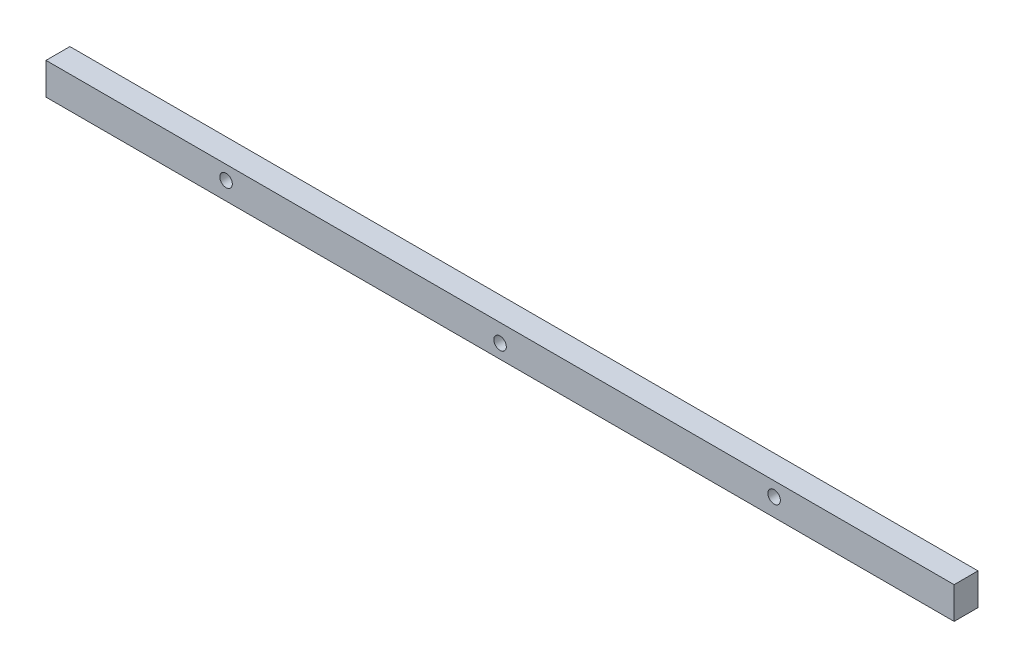
ISO-10303-21;
HEADER;
FILE_DESCRIPTION(('STEP AP214'),'2;1');
FILE_NAME('part.step','',(''),(''),'','','');
FILE_SCHEMA(('AUTOMOTIVE_DESIGN { 1 0 10303 214 1 1 1 1 }'));
ENDSEC;
DATA;
#1=APPLICATION_CONTEXT('core data for automotive mechanical design processes');
#2=APPLICATION_PROTOCOL_DEFINITION('international standard','automotive_design',2000,#1);
#3=PRODUCT_CONTEXT('',#1,'mechanical');
#4=PRODUCT('Part','Part','',(#3));
#5=PRODUCT_RELATED_PRODUCT_CATEGORY('part','',(#4));
#6=PRODUCT_DEFINITION_FORMATION('','',#4);
#7=PRODUCT_DEFINITION_CONTEXT('part definition',#1,'design');
#8=PRODUCT_DEFINITION('design','',#6,#7);
#9=PRODUCT_DEFINITION_SHAPE('','',#8);
#10=(LENGTH_UNIT() NAMED_UNIT(*) SI_UNIT(.MILLI.,.METRE.));
#11=(NAMED_UNIT(*) PLANE_ANGLE_UNIT() SI_UNIT($,.RADIAN.));
#12=(NAMED_UNIT(*) SI_UNIT($,.STERADIAN.) SOLID_ANGLE_UNIT());
#13=UNCERTAINTY_MEASURE_WITH_UNIT(LENGTH_MEASURE(1.E-05),#10,'distance_accuracy_value','');
#14=(GEOMETRIC_REPRESENTATION_CONTEXT(3) GLOBAL_UNCERTAINTY_ASSIGNED_CONTEXT((#13)) GLOBAL_UNIT_ASSIGNED_CONTEXT((#10,
#11,#12)) REPRESENTATION_CONTEXT('',''));
#15=CARTESIAN_POINT('',(0.,0.,0.));
#16=DIRECTION('',(0.,0.,1.));
#17=DIRECTION('',(1.,0.,0.));
#18=AXIS2_PLACEMENT_3D('',#15,#16,#17);
#19=CARTESIAN_POINT('',(0.,0.,9.525));
#20=DIRECTION('',(0.,0.,-1.));
#21=DIRECTION('',(-1.,0.,0.));
#22=AXIS2_PLACEMENT_3D('',#19,#20,#21);
#23=PLANE('',#22);
#24=DIRECTION('',(0.,-1.,0.));
#25=VECTOR('',#24,1.);
#26=CARTESIAN_POINT('',(0.,0.,9.525));
#27=LINE('',#26,#25);
#28=CARTESIAN_POINT('',(0.,12.7,9.525));
#29=VERTEX_POINT('',#28);
#30=CARTESIAN_POINT('',(0.,0.,9.525));
#31=VERTEX_POINT('',#30);
#32=EDGE_CURVE('E85',#29,#31,#27,.T.);
#33=ORIENTED_EDGE('',*,*,#32,.T.);
#34=DIRECTION('',(1.,0.,0.));
#35=VECTOR('',#34,1.);
#36=CARTESIAN_POINT('',(0.,0.,9.525));
#37=LINE('',#36,#35);
#38=CARTESIAN_POINT('',(361.95,0.,9.525));
#39=VERTEX_POINT('',#38);
#40=EDGE_CURVE('E80',#31,#39,#37,.T.);
#41=ORIENTED_EDGE('',*,*,#40,.T.);
#42=DIRECTION('',(0.,1.,0.));
#43=VECTOR('',#42,1.);
#44=CARTESIAN_POINT('',(361.95,0.,9.525));
#45=LINE('',#44,#43);
#46=CARTESIAN_POINT('',(361.95,12.7,9.525));
#47=VERTEX_POINT('',#46);
#48=EDGE_CURVE('E83',#39,#47,#45,.T.);
#49=ORIENTED_EDGE('',*,*,#48,.T.);
#50=DIRECTION('',(-1.,0.,0.));
#51=VECTOR('',#50,1.);
#52=CARTESIAN_POINT('',(0.,12.7,9.525));
#53=LINE('',#52,#51);
#54=EDGE_CURVE('E50',#47,#29,#53,.T.);
#55=ORIENTED_EDGE('',*,*,#54,.T.);
#56=EDGE_LOOP('',(#33,#41,#49,#55));
#57=FACE_BOUND('',#56,.T.);
#58=CARTESIAN_POINT('',(180.975,5.55625,9.525));
#59=DIRECTION('',(0.,0.,1.));
#60=DIRECTION('',(1.,0.,0.));
#61=AXIS2_PLACEMENT_3D('',#58,#59,#60);
#62=CIRCLE('',#61,2.5);
#63=CARTESIAN_POINT('',(178.475,5.55625,9.525));
#64=VERTEX_POINT('',#63);
#65=EDGE_CURVE('E100',#64,#64,#62,.T.);
#66=ORIENTED_EDGE('',*,*,#65,.F.);
#67=EDGE_LOOP('',(#66));
#68=FACE_BOUND('',#67,.T.);
#69=CARTESIAN_POINT('',(71.755,7.14375,9.525));
#70=DIRECTION('',(0.,0.,1.));
#71=DIRECTION('',(1.,0.,0.));
#72=AXIS2_PLACEMENT_3D('',#69,#70,#71);
#73=CIRCLE('',#72,2.49999999999999);
#74=CARTESIAN_POINT('',(69.255,7.14375,9.525));
#75=VERTEX_POINT('',#74);
#76=EDGE_CURVE('E115',#75,#75,#73,.T.);
#77=ORIENTED_EDGE('',*,*,#76,.F.);
#78=EDGE_LOOP('',(#77));
#79=FACE_BOUND('',#78,.T.);
#80=CARTESIAN_POINT('',(290.195,7.14375000000004,9.525));
#81=DIRECTION('',(0.,0.,1.));
#82=DIRECTION('',(1.,0.,0.));
#83=AXIS2_PLACEMENT_3D('',#80,#81,#82);
#84=CIRCLE('',#83,2.49999999999996);
#85=CARTESIAN_POINT('',(287.695,7.14375000000004,9.525));
#86=VERTEX_POINT('',#85);
#87=EDGE_CURVE('E121',#86,#86,#84,.T.);
#88=ORIENTED_EDGE('',*,*,#87,.F.);
#89=EDGE_LOOP('',(#88));
#90=FACE_BOUND('',#89,.T.);
#91=ADVANCED_FACE('F33',(#57,#68,#79,#90),#23,.F.);
#92=CARTESIAN_POINT('',(0.,0.,0.));
#93=DIRECTION('',(0.,0.,-1.));
#94=DIRECTION('',(-1.,0.,0.));
#95=AXIS2_PLACEMENT_3D('',#92,#93,#94);
#96=PLANE('',#95);
#97=CARTESIAN_POINT('',(71.755,7.14375,0.));
#98=DIRECTION('',(0.,0.,1.));
#99=DIRECTION('',(1.,0.,0.));
#100=AXIS2_PLACEMENT_3D('',#97,#98,#99);
#101=CIRCLE('',#100,2.49999999999999);
#102=CARTESIAN_POINT('',(69.255,7.14375,0.));
#103=VERTEX_POINT('',#102);
#104=EDGE_CURVE('E118',#103,#103,#101,.T.);
#105=ORIENTED_EDGE('',*,*,#104,.T.);
#106=EDGE_LOOP('',(#105));
#107=FACE_BOUND('',#106,.T.);
#108=DIRECTION('',(0.,-1.,0.));
#109=VECTOR('',#108,1.);
#110=CARTESIAN_POINT('',(0.,0.,0.));
#111=LINE('',#110,#109);
#112=CARTESIAN_POINT('',(0.,12.7,0.));
#113=VERTEX_POINT('',#112);
#114=CARTESIAN_POINT('',(0.,0.,0.));
#115=VERTEX_POINT('',#114);
#116=EDGE_CURVE('E97',#113,#115,#111,.T.);
#117=ORIENTED_EDGE('',*,*,#116,.F.);
#118=DIRECTION('',(-1.,0.,0.));
#119=VECTOR('',#118,1.);
#120=CARTESIAN_POINT('',(0.,12.7,0.));
#121=LINE('',#120,#119);
#122=CARTESIAN_POINT('',(361.95,12.7,0.));
#123=VERTEX_POINT('',#122);
#124=EDGE_CURVE('E73',#123,#113,#121,.T.);
#125=ORIENTED_EDGE('',*,*,#124,.F.);
#126=DIRECTION('',(0.,1.,0.));
#127=VECTOR('',#126,1.);
#128=CARTESIAN_POINT('',(361.95,0.,0.));
#129=LINE('',#128,#127);
#130=CARTESIAN_POINT('',(361.95,0.,0.));
#131=VERTEX_POINT('',#130);
#132=EDGE_CURVE('E67',#131,#123,#129,.T.);
#133=ORIENTED_EDGE('',*,*,#132,.F.);
#134=DIRECTION('',(1.,0.,0.));
#135=VECTOR('',#134,1.);
#136=CARTESIAN_POINT('',(0.,0.,0.));
#137=LINE('',#136,#135);
#138=EDGE_CURVE('E89',#115,#131,#137,.T.);
#139=ORIENTED_EDGE('',*,*,#138,.F.);
#140=EDGE_LOOP('',(#117,#125,#133,#139));
#141=FACE_BOUND('',#140,.T.);
#142=CARTESIAN_POINT('',(180.975,5.55625,0.));
#143=DIRECTION('',(0.,0.,1.));
#144=DIRECTION('',(1.,0.,0.));
#145=AXIS2_PLACEMENT_3D('',#142,#143,#144);
#146=CIRCLE('',#145,2.5);
#147=CARTESIAN_POINT('',(178.475,5.55625,0.));
#148=VERTEX_POINT('',#147);
#149=EDGE_CURVE('E112',#148,#148,#146,.T.);
#150=ORIENTED_EDGE('',*,*,#149,.T.);
#151=EDGE_LOOP('',(#150));
#152=FACE_BOUND('',#151,.T.);
#153=CARTESIAN_POINT('',(290.195,7.14375000000004,0.));
#154=DIRECTION('',(0.,0.,1.));
#155=DIRECTION('',(1.,0.,0.));
#156=AXIS2_PLACEMENT_3D('',#153,#154,#155);
#157=CIRCLE('',#156,2.49999999999996);
#158=CARTESIAN_POINT('',(287.695,7.14375000000004,0.));
#159=VERTEX_POINT('',#158);
#160=EDGE_CURVE('E124',#159,#159,#157,.T.);
#161=ORIENTED_EDGE('',*,*,#160,.T.);
#162=EDGE_LOOP('',(#161));
#163=FACE_BOUND('',#162,.T.);
#164=ADVANCED_FACE('F108',(#107,#141,#152,#163),#96,.T.);
#165=CARTESIAN_POINT('',(0.,0.,9.525));
#166=DIRECTION('',(1.,0.,0.));
#167=DIRECTION('',(0.,0.,-1.));
#168=AXIS2_PLACEMENT_3D('',#165,#166,#167);
#169=PLANE('',#168);
#170=ORIENTED_EDGE('',*,*,#116,.T.);
#171=DIRECTION('',(0.,0.,-1.));
#172=VECTOR('',#171,1.);
#173=CARTESIAN_POINT('',(0.,0.,9.525));
#174=LINE('',#173,#172);
#175=EDGE_CURVE('E11',#31,#115,#174,.T.);
#176=ORIENTED_EDGE('',*,*,#175,.F.);
#177=ORIENTED_EDGE('',*,*,#32,.F.);
#178=DIRECTION('',(0.,0.,-1.));
#179=VECTOR('',#178,1.);
#180=CARTESIAN_POINT('',(0.,12.7,9.525));
#181=LINE('',#180,#179);
#182=EDGE_CURVE('E93',#29,#113,#181,.T.);
#183=ORIENTED_EDGE('',*,*,#182,.T.);
#184=EDGE_LOOP('',(#170,#176,#177,#183));
#185=FACE_BOUND('',#184,.T.);
#186=ADVANCED_FACE('F35',(#185),#169,.F.);
#187=CARTESIAN_POINT('',(0.,0.,9.525));
#188=DIRECTION('',(0.,1.,0.));
#189=DIRECTION('',(0.,0.,1.));
#190=AXIS2_PLACEMENT_3D('',#187,#188,#189);
#191=PLANE('',#190);
#192=ORIENTED_EDGE('',*,*,#138,.T.);
#193=DIRECTION('',(0.,0.,-1.));
#194=VECTOR('',#193,1.);
#195=CARTESIAN_POINT('',(361.95,0.,9.525));
#196=LINE('',#195,#194);
#197=EDGE_CURVE('E42',#39,#131,#196,.T.);
#198=ORIENTED_EDGE('',*,*,#197,.F.);
#199=ORIENTED_EDGE('',*,*,#40,.F.);
#200=ORIENTED_EDGE('',*,*,#175,.T.);
#201=EDGE_LOOP('',(#192,#198,#199,#200));
#202=FACE_BOUND('',#201,.T.);
#203=ADVANCED_FACE('F88',(#202),#191,.F.);
#204=CARTESIAN_POINT('',(361.95,0.,9.525));
#205=DIRECTION('',(-1.,0.,0.));
#206=DIRECTION('',(0.,0.,1.));
#207=AXIS2_PLACEMENT_3D('',#204,#205,#206);
#208=PLANE('',#207);
#209=ORIENTED_EDGE('',*,*,#132,.T.);
#210=DIRECTION('',(0.,0.,-1.));
#211=VECTOR('',#210,1.);
#212=CARTESIAN_POINT('',(361.95,12.7,9.525));
#213=LINE('',#212,#211);
#214=EDGE_CURVE('E90',#47,#123,#213,.T.);
#215=ORIENTED_EDGE('',*,*,#214,.F.);
#216=ORIENTED_EDGE('',*,*,#48,.F.);
#217=ORIENTED_EDGE('',*,*,#197,.T.);
#218=EDGE_LOOP('',(#209,#215,#216,#217));
#219=FACE_BOUND('',#218,.T.);
#220=ADVANCED_FACE('F91',(#219),#208,.F.);
#221=CARTESIAN_POINT('',(0.,12.7,9.525));
#222=DIRECTION('',(0.,-1.,0.));
#223=DIRECTION('',(0.,0.,-1.));
#224=AXIS2_PLACEMENT_3D('',#221,#222,#223);
#225=PLANE('',#224);
#226=ORIENTED_EDGE('',*,*,#124,.T.);
#227=ORIENTED_EDGE('',*,*,#182,.F.);
#228=ORIENTED_EDGE('',*,*,#54,.F.);
#229=ORIENTED_EDGE('',*,*,#214,.T.);
#230=EDGE_LOOP('',(#226,#227,#228,#229));
#231=FACE_BOUND('',#230,.T.);
#232=ADVANCED_FACE('F105',(#231),#225,.F.);
#233=CARTESIAN_POINT('',(180.975,5.55625,9.525));
#234=DIRECTION('',(0.,0.,-1.));
#235=DIRECTION('',(-1.,0.,0.));
#236=AXIS2_PLACEMENT_3D('',#233,#234,#235);
#237=CYLINDRICAL_SURFACE('',#236,2.5);
#238=CARTESIAN_POINT('',(178.475,5.55625,9.525));
#239=CARTESIAN_POINT('',(178.475,5.55625,9.42578125));
#240=CARTESIAN_POINT('',(178.475,5.55625,9.3265625));
#241=CARTESIAN_POINT('',(178.475,5.55625,9.128125));
#242=CARTESIAN_POINT('',(178.475,5.55625,9.02890625));
#243=CARTESIAN_POINT('',(178.475,5.55625,8.83046875));
#244=CARTESIAN_POINT('',(178.475,5.55625,8.73125));
#245=CARTESIAN_POINT('',(178.475,5.55625,8.5328125));
#246=CARTESIAN_POINT('',(178.475,5.55625,8.43359375));
#247=CARTESIAN_POINT('',(178.475,5.55625,8.23515625));
#248=CARTESIAN_POINT('',(178.475,5.55625,8.1359375));
#249=CARTESIAN_POINT('',(178.475,5.55625,7.9375));
#250=CARTESIAN_POINT('',(178.475,5.55625,7.83828125));
#251=CARTESIAN_POINT('',(178.475,5.55625,7.63984375));
#252=CARTESIAN_POINT('',(178.475,5.55625,7.540625));
#253=CARTESIAN_POINT('',(178.475,5.55625,7.3421875));
#254=CARTESIAN_POINT('',(178.475,5.55625,7.24296875));
#255=CARTESIAN_POINT('',(178.475,5.55625,7.04453125));
#256=CARTESIAN_POINT('',(178.475,5.55625,6.9453125));
#257=CARTESIAN_POINT('',(178.475,5.55625,6.746875));
#258=CARTESIAN_POINT('',(178.475,5.55625,6.64765625));
#259=CARTESIAN_POINT('',(178.475,5.55625,6.44921875));
#260=CARTESIAN_POINT('',(178.475,5.55625,6.35));
#261=CARTESIAN_POINT('',(178.475,5.55625,6.1515625));
#262=CARTESIAN_POINT('',(178.475,5.55625,6.05234375));
#263=CARTESIAN_POINT('',(178.475,5.55625,5.85390625));
#264=CARTESIAN_POINT('',(178.475,5.55625,5.7546875));
#265=CARTESIAN_POINT('',(178.475,5.55625,5.55625));
#266=CARTESIAN_POINT('',(178.475,5.55625,5.45703125));
#267=CARTESIAN_POINT('',(178.475,5.55625,5.25859375));
#268=CARTESIAN_POINT('',(178.475,5.55625,5.159375));
#269=CARTESIAN_POINT('',(178.475,5.55625,4.9609375));
#270=CARTESIAN_POINT('',(178.475,5.55625,4.86171875));
#271=CARTESIAN_POINT('',(178.475,5.55625,4.66328125));
#272=CARTESIAN_POINT('',(178.475,5.55625,4.5640625));
#273=CARTESIAN_POINT('',(178.475,5.55625,4.365625));
#274=CARTESIAN_POINT('',(178.475,5.55625,4.26640625));
#275=CARTESIAN_POINT('',(178.475,5.55625,4.06796875));
#276=CARTESIAN_POINT('',(178.475,5.55625,3.96875));
#277=CARTESIAN_POINT('',(178.475,5.55625,3.7703125));
#278=CARTESIAN_POINT('',(178.475,5.55625,3.67109375));
#279=CARTESIAN_POINT('',(178.475,5.55625,3.47265625));
#280=CARTESIAN_POINT('',(178.475,5.55625,3.3734375));
#281=CARTESIAN_POINT('',(178.475,5.55625,3.175));
#282=CARTESIAN_POINT('',(178.475,5.55625,3.07578125));
#283=CARTESIAN_POINT('',(178.475,5.55625,2.87734375));
#284=CARTESIAN_POINT('',(178.475,5.55625,2.778125));
#285=CARTESIAN_POINT('',(178.475,5.55625,2.5796875));
#286=CARTESIAN_POINT('',(178.475,5.55625,2.48046875));
#287=CARTESIAN_POINT('',(178.475,5.55625,2.28203125));
#288=CARTESIAN_POINT('',(178.475,5.55625,2.1828125));
#289=CARTESIAN_POINT('',(178.475,5.55625,1.984375));
#290=CARTESIAN_POINT('',(178.475,5.55625,1.88515625));
#291=CARTESIAN_POINT('',(178.475,5.55625,1.68671875));
#292=CARTESIAN_POINT('',(178.475,5.55625,1.5875));
#293=CARTESIAN_POINT('',(178.475,5.55625,1.3890625));
#294=CARTESIAN_POINT('',(178.475,5.55625,1.28984375));
#295=CARTESIAN_POINT('',(178.475,5.55625,1.09140625));
#296=CARTESIAN_POINT('',(178.475,5.55625,0.992187500000001));
#297=CARTESIAN_POINT('',(178.475,5.55625,0.793750000000001));
#298=CARTESIAN_POINT('',(178.475,5.55625,0.69453125));
#299=CARTESIAN_POINT('',(178.475,5.55625,0.49609375));
#300=CARTESIAN_POINT('',(178.475,5.55625,0.396875));
#301=CARTESIAN_POINT('',(178.475,5.55625,0.1984375));
#302=CARTESIAN_POINT('',(178.475,5.55625,0.0992187500000001));
#303=CARTESIAN_POINT('',(178.475,5.55625,0.));
#304=B_SPLINE_CURVE_WITH_KNOTS('',3,(#238,#239,#240,#241,#242,#243,#244,#245,#246,#247,#248,
#249,#250,#251,#252,#253,#254,#255,#256,#257,#258,#259,#260,#261,#262,#263,#264,#265,#266,#267,
#268,#269,#270,#271,#272,#273,#274,#275,#276,#277,#278,#279,#280,#281,#282,#283,#284,#285,#286,
#287,#288,#289,#290,#291,#292,#293,#294,#295,#296,#297,#298,#299,#300,#301,#302,#303),
.UNSPECIFIED.,.F.,.F.,(4,2,2,2,2,2,2,2,2,2,2,2,2,2,2,2,2,2,2,2,2,2,2,2,2,2,2,2,2,2,2,2,4),(0.,
0.29765625,0.5953125,0.892968750000001,1.190625,1.48828125,1.7859375,2.08359375,2.38125,
2.67890625,2.9765625,3.27421875,3.571875,3.86953125,4.1671875,4.46484375,4.7625,5.06015625,
5.3578125,5.65546875,5.953125,6.25078125,6.5484375,6.84609375,7.14375,7.44140625,7.7390625,
8.03671875,8.334375,8.63203125,8.9296875,9.22734375,9.525),.UNSPECIFIED.);
#305=EDGE_CURVE('BSEAM141',#64,#148,#304,.T.);
#306=ORIENTED_EDGE('',*,*,#65,.T.);
#307=ORIENTED_EDGE('',*,*,#149,.F.);
#308=ORIENTED_EDGE('',*,*,#305,.T.);
#309=ORIENTED_EDGE('',*,*,#305,.F.);
#310=EDGE_LOOP('',(#306,#308,#307,#309));
#311=FACE_BOUND('',#310,.T.);
#312=ADVANCED_FACE('F141',(#311),#237,.F.);
#313=CARTESIAN_POINT('',(71.755,7.14375,9.525));
#314=DIRECTION('',(0.,0.,-1.));
#315=DIRECTION('',(-1.,0.,0.));
#316=AXIS2_PLACEMENT_3D('',#313,#314,#315);
#317=CYLINDRICAL_SURFACE('',#316,2.49999999999999);
#318=CARTESIAN_POINT('',(69.255,7.14375,9.525));
#319=CARTESIAN_POINT('',(69.255,7.14375,9.42578125));
#320=CARTESIAN_POINT('',(69.255,7.14375,9.3265625));
#321=CARTESIAN_POINT('',(69.255,7.14375,9.128125));
#322=CARTESIAN_POINT('',(69.255,7.14375,9.02890625));
#323=CARTESIAN_POINT('',(69.255,7.14375,8.83046875));
#324=CARTESIAN_POINT('',(69.255,7.14375,8.73125));
#325=CARTESIAN_POINT('',(69.255,7.14375,8.5328125));
#326=CARTESIAN_POINT('',(69.255,7.14375,8.43359375));
#327=CARTESIAN_POINT('',(69.255,7.14375,8.23515625));
#328=CARTESIAN_POINT('',(69.255,7.14375,8.1359375));
#329=CARTESIAN_POINT('',(69.255,7.14375,7.9375));
#330=CARTESIAN_POINT('',(69.255,7.14375,7.83828125));
#331=CARTESIAN_POINT('',(69.255,7.14375,7.63984375));
#332=CARTESIAN_POINT('',(69.255,7.14375,7.540625));
#333=CARTESIAN_POINT('',(69.255,7.14375,7.3421875));
#334=CARTESIAN_POINT('',(69.255,7.14375,7.24296875));
#335=CARTESIAN_POINT('',(69.255,7.14375,7.04453125));
#336=CARTESIAN_POINT('',(69.255,7.14375,6.9453125));
#337=CARTESIAN_POINT('',(69.255,7.14375,6.746875));
#338=CARTESIAN_POINT('',(69.255,7.14375,6.64765625));
#339=CARTESIAN_POINT('',(69.255,7.14375,6.44921875));
#340=CARTESIAN_POINT('',(69.255,7.14375,6.35));
#341=CARTESIAN_POINT('',(69.255,7.14375,6.1515625));
#342=CARTESIAN_POINT('',(69.255,7.14375,6.05234375));
#343=CARTESIAN_POINT('',(69.255,7.14375,5.85390625));
#344=CARTESIAN_POINT('',(69.255,7.14375,5.7546875));
#345=CARTESIAN_POINT('',(69.255,7.14375,5.55625));
#346=CARTESIAN_POINT('',(69.255,7.14375,5.45703125));
#347=CARTESIAN_POINT('',(69.255,7.14375,5.25859375));
#348=CARTESIAN_POINT('',(69.255,7.14375,5.159375));
#349=CARTESIAN_POINT('',(69.255,7.14375,4.9609375));
#350=CARTESIAN_POINT('',(69.255,7.14375,4.86171875));
#351=CARTESIAN_POINT('',(69.255,7.14375,4.66328125));
#352=CARTESIAN_POINT('',(69.255,7.14375,4.5640625));
#353=CARTESIAN_POINT('',(69.255,7.14375,4.365625));
#354=CARTESIAN_POINT('',(69.255,7.14375,4.26640625));
#355=CARTESIAN_POINT('',(69.255,7.14375,4.06796875));
#356=CARTESIAN_POINT('',(69.255,7.14375,3.96875));
#357=CARTESIAN_POINT('',(69.255,7.14375,3.7703125));
#358=CARTESIAN_POINT('',(69.255,7.14375,3.67109375));
#359=CARTESIAN_POINT('',(69.255,7.14375,3.47265625));
#360=CARTESIAN_POINT('',(69.255,7.14375,3.3734375));
#361=CARTESIAN_POINT('',(69.255,7.14375,3.175));
#362=CARTESIAN_POINT('',(69.255,7.14375,3.07578125));
#363=CARTESIAN_POINT('',(69.255,7.14375,2.87734375));
#364=CARTESIAN_POINT('',(69.255,7.14375,2.778125));
#365=CARTESIAN_POINT('',(69.255,7.14375,2.5796875));
#366=CARTESIAN_POINT('',(69.255,7.14375,2.48046875));
#367=CARTESIAN_POINT('',(69.255,7.14375,2.28203125));
#368=CARTESIAN_POINT('',(69.255,7.14375,2.1828125));
#369=CARTESIAN_POINT('',(69.255,7.14375,1.984375));
#370=CARTESIAN_POINT('',(69.255,7.14375,1.88515625));
#371=CARTESIAN_POINT('',(69.255,7.14375,1.68671875));
#372=CARTESIAN_POINT('',(69.255,7.14375,1.5875));
#373=CARTESIAN_POINT('',(69.255,7.14375,1.3890625));
#374=CARTESIAN_POINT('',(69.255,7.14375,1.28984375));
#375=CARTESIAN_POINT('',(69.255,7.14375,1.09140625));
#376=CARTESIAN_POINT('',(69.255,7.14375,0.992187500000001));
#377=CARTESIAN_POINT('',(69.255,7.14375,0.793750000000001));
#378=CARTESIAN_POINT('',(69.255,7.14375,0.69453125));
#379=CARTESIAN_POINT('',(69.255,7.14375,0.49609375));
#380=CARTESIAN_POINT('',(69.255,7.14375,0.396875));
#381=CARTESIAN_POINT('',(69.255,7.14375,0.1984375));
#382=CARTESIAN_POINT('',(69.255,7.14375,0.0992187500000001));
#383=CARTESIAN_POINT('',(69.255,7.14375,0.));
#384=B_SPLINE_CURVE_WITH_KNOTS('',3,(#318,#319,#320,#321,#322,#323,#324,#325,#326,#327,#328,
#329,#330,#331,#332,#333,#334,#335,#336,#337,#338,#339,#340,#341,#342,#343,#344,#345,#346,#347,
#348,#349,#350,#351,#352,#353,#354,#355,#356,#357,#358,#359,#360,#361,#362,#363,#364,#365,#366,
#367,#368,#369,#370,#371,#372,#373,#374,#375,#376,#377,#378,#379,#380,#381,#382,#383),
.UNSPECIFIED.,.F.,.F.,(4,2,2,2,2,2,2,2,2,2,2,2,2,2,2,2,2,2,2,2,2,2,2,2,2,2,2,2,2,2,2,2,4),(0.,
0.29765625,0.5953125,0.892968750000001,1.190625,1.48828125,1.7859375,2.08359375,2.38125,
2.67890625,2.9765625,3.27421875,3.571875,3.86953125,4.1671875,4.46484375,4.7625,5.06015625,
5.3578125,5.65546875,5.953125,6.25078125,6.5484375,6.84609375,7.14375,7.44140625,7.7390625,
8.03671875,8.334375,8.63203125,8.9296875,9.22734375,9.525),.UNSPECIFIED.);
#385=EDGE_CURVE('BSEAM187',#75,#103,#384,.T.);
#386=ORIENTED_EDGE('',*,*,#76,.T.);
#387=ORIENTED_EDGE('',*,*,#104,.F.);
#388=ORIENTED_EDGE('',*,*,#385,.T.);
#389=ORIENTED_EDGE('',*,*,#385,.F.);
#390=EDGE_LOOP('',(#386,#388,#387,#389));
#391=FACE_BOUND('',#390,.T.);
#392=ADVANCED_FACE('F187',(#391),#317,.F.);
#393=CARTESIAN_POINT('',(290.195,7.14375000000004,9.525));
#394=DIRECTION('',(0.,0.,-1.));
#395=DIRECTION('',(-1.,0.,0.));
#396=AXIS2_PLACEMENT_3D('',#393,#394,#395);
#397=CYLINDRICAL_SURFACE('',#396,2.49999999999996);
#398=CARTESIAN_POINT('',(287.695,7.14375000000004,9.525));
#399=CARTESIAN_POINT('',(287.695,7.14375000000004,9.42578125));
#400=CARTESIAN_POINT('',(287.695,7.14375000000004,9.3265625));
#401=CARTESIAN_POINT('',(287.695,7.14375000000004,9.128125));
#402=CARTESIAN_POINT('',(287.695,7.14375000000004,9.02890625));
#403=CARTESIAN_POINT('',(287.695,7.14375000000004,8.83046875));
#404=CARTESIAN_POINT('',(287.695,7.14375000000004,8.73125));
#405=CARTESIAN_POINT('',(287.695,7.14375000000004,8.5328125));
#406=CARTESIAN_POINT('',(287.695,7.14375000000004,8.43359375));
#407=CARTESIAN_POINT('',(287.695,7.14375000000004,8.23515625));
#408=CARTESIAN_POINT('',(287.695,7.14375000000004,8.1359375));
#409=CARTESIAN_POINT('',(287.695,7.14375000000004,7.9375));
#410=CARTESIAN_POINT('',(287.695,7.14375000000004,7.83828125));
#411=CARTESIAN_POINT('',(287.695,7.14375000000004,7.63984375));
#412=CARTESIAN_POINT('',(287.695,7.14375000000004,7.540625));
#413=CARTESIAN_POINT('',(287.695,7.14375000000004,7.3421875));
#414=CARTESIAN_POINT('',(287.695,7.14375000000004,7.24296875));
#415=CARTESIAN_POINT('',(287.695,7.14375000000004,7.04453125));
#416=CARTESIAN_POINT('',(287.695,7.14375000000004,6.9453125));
#417=CARTESIAN_POINT('',(287.695,7.14375000000004,6.746875));
#418=CARTESIAN_POINT('',(287.695,7.14375000000004,6.64765625));
#419=CARTESIAN_POINT('',(287.695,7.14375000000004,6.44921875));
#420=CARTESIAN_POINT('',(287.695,7.14375000000004,6.35));
#421=CARTESIAN_POINT('',(287.695,7.14375000000004,6.1515625));
#422=CARTESIAN_POINT('',(287.695,7.14375000000004,6.05234375));
#423=CARTESIAN_POINT('',(287.695,7.14375000000004,5.85390625));
#424=CARTESIAN_POINT('',(287.695,7.14375000000004,5.7546875));
#425=CARTESIAN_POINT('',(287.695,7.14375000000004,5.55625));
#426=CARTESIAN_POINT('',(287.695,7.14375000000004,5.45703125));
#427=CARTESIAN_POINT('',(287.695,7.14375000000004,5.25859375));
#428=CARTESIAN_POINT('',(287.695,7.14375000000004,5.159375));
#429=CARTESIAN_POINT('',(287.695,7.14375000000004,4.9609375));
#430=CARTESIAN_POINT('',(287.695,7.14375000000004,4.86171875));
#431=CARTESIAN_POINT('',(287.695,7.14375000000004,4.66328125));
#432=CARTESIAN_POINT('',(287.695,7.14375000000004,4.5640625));
#433=CARTESIAN_POINT('',(287.695,7.14375000000004,4.365625));
#434=CARTESIAN_POINT('',(287.695,7.14375000000004,4.26640625));
#435=CARTESIAN_POINT('',(287.695,7.14375000000004,4.06796875));
#436=CARTESIAN_POINT('',(287.695,7.14375000000004,3.96875));
#437=CARTESIAN_POINT('',(287.695,7.14375000000004,3.7703125));
#438=CARTESIAN_POINT('',(287.695,7.14375000000004,3.67109375));
#439=CARTESIAN_POINT('',(287.695,7.14375000000004,3.47265625));
#440=CARTESIAN_POINT('',(287.695,7.14375000000004,3.3734375));
#441=CARTESIAN_POINT('',(287.695,7.14375000000004,3.175));
#442=CARTESIAN_POINT('',(287.695,7.14375000000004,3.07578125));
#443=CARTESIAN_POINT('',(287.695,7.14375000000004,2.87734375));
#444=CARTESIAN_POINT('',(287.695,7.14375000000004,2.778125));
#445=CARTESIAN_POINT('',(287.695,7.14375000000004,2.5796875));
#446=CARTESIAN_POINT('',(287.695,7.14375000000004,2.48046875));
#447=CARTESIAN_POINT('',(287.695,7.14375000000004,2.28203125));
#448=CARTESIAN_POINT('',(287.695,7.14375000000004,2.1828125));
#449=CARTESIAN_POINT('',(287.695,7.14375000000004,1.984375));
#450=CARTESIAN_POINT('',(287.695,7.14375000000004,1.88515625));
#451=CARTESIAN_POINT('',(287.695,7.14375000000004,1.68671875));
#452=CARTESIAN_POINT('',(287.695,7.14375000000004,1.5875));
#453=CARTESIAN_POINT('',(287.695,7.14375000000004,1.3890625));
#454=CARTESIAN_POINT('',(287.695,7.14375000000004,1.28984375));
#455=CARTESIAN_POINT('',(287.695,7.14375000000004,1.09140625));
#456=CARTESIAN_POINT('',(287.695,7.14375000000004,0.992187500000001));
#457=CARTESIAN_POINT('',(287.695,7.14375000000004,0.793750000000001));
#458=CARTESIAN_POINT('',(287.695,7.14375000000004,0.69453125));
#459=CARTESIAN_POINT('',(287.695,7.14375000000004,0.49609375));
#460=CARTESIAN_POINT('',(287.695,7.14375000000004,0.396875));
#461=CARTESIAN_POINT('',(287.695,7.14375000000004,0.1984375));
#462=CARTESIAN_POINT('',(287.695,7.14375000000004,0.0992187500000001));
#463=CARTESIAN_POINT('',(287.695,7.14375000000004,0.));
#464=B_SPLINE_CURVE_WITH_KNOTS('',3,(#398,#399,#400,#401,#402,#403,#404,#405,#406,#407,#408,
#409,#410,#411,#412,#413,#414,#415,#416,#417,#418,#419,#420,#421,#422,#423,#424,#425,#426,#427,
#428,#429,#430,#431,#432,#433,#434,#435,#436,#437,#438,#439,#440,#441,#442,#443,#444,#445,#446,
#447,#448,#449,#450,#451,#452,#453,#454,#455,#456,#457,#458,#459,#460,#461,#462,#463),
.UNSPECIFIED.,.F.,.F.,(4,2,2,2,2,2,2,2,2,2,2,2,2,2,2,2,2,2,2,2,2,2,2,2,2,2,2,2,2,2,2,2,4),(0.,
0.29765625,0.5953125,0.892968750000001,1.190625,1.48828125,1.7859375,2.08359375,2.38125,
2.67890625,2.9765625,3.27421875,3.571875,3.86953125,4.1671875,4.46484375,4.7625,5.06015625,
5.3578125,5.65546875,5.953125,6.25078125,6.5484375,6.84609375,7.14375,7.44140625,7.7390625,
8.03671875,8.334375,8.63203125,8.9296875,9.22734375,9.525),.UNSPECIFIED.);
#465=EDGE_CURVE('BSEAM130',#86,#159,#464,.T.);
#466=ORIENTED_EDGE('',*,*,#87,.T.);
#467=ORIENTED_EDGE('',*,*,#160,.F.);
#468=ORIENTED_EDGE('',*,*,#465,.T.);
#469=ORIENTED_EDGE('',*,*,#465,.F.);
#470=EDGE_LOOP('',(#466,#468,#467,#469));
#471=FACE_BOUND('',#470,.T.);
#472=ADVANCED_FACE('F130',(#471),#397,.F.);
#473=CLOSED_SHELL('',(#91,#164,#186,#203,#220,#232,#312,#392,#472));
#474=MANIFOLD_SOLID_BREP('B2',#473);
#475=ADVANCED_BREP_SHAPE_REPRESENTATION('',(#18,#474),#14);
#476=SHAPE_DEFINITION_REPRESENTATION(#9,#475);
ENDSEC;
END-ISO-10303-21;
